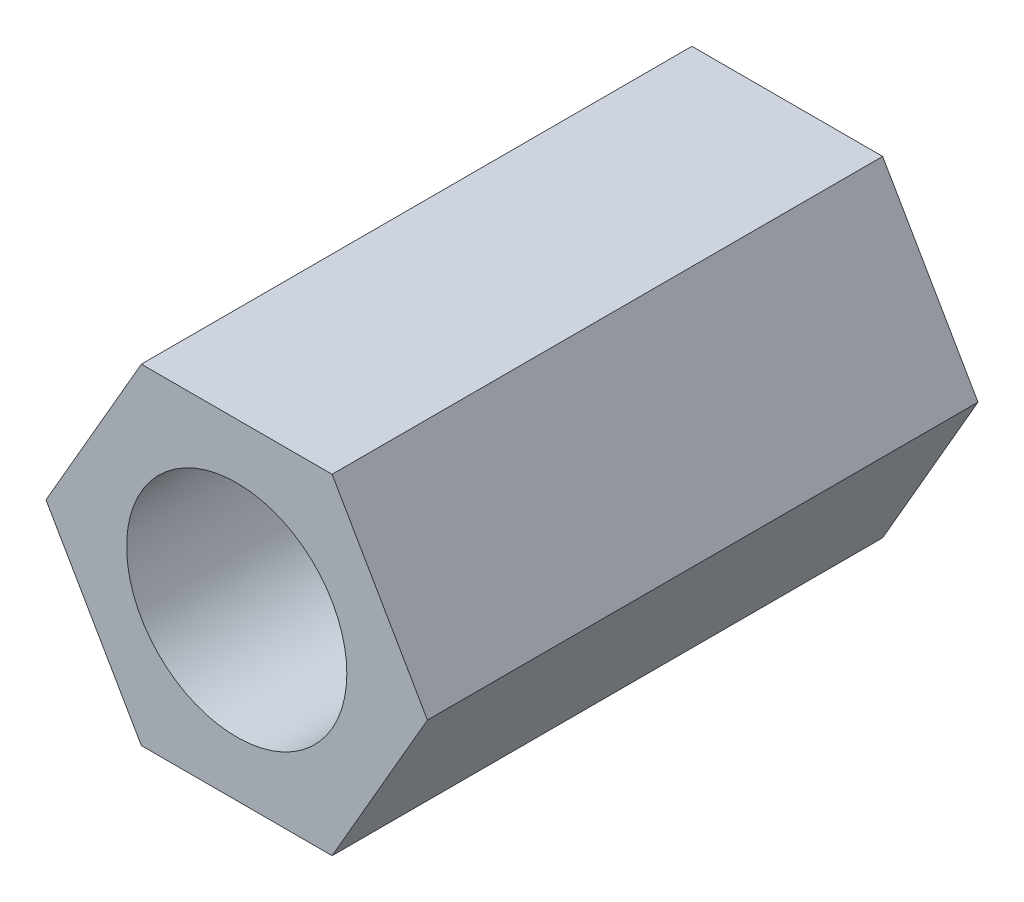
ISO-10303-21;
HEADER;
FILE_DESCRIPTION(('STEP AP214'),'2;1');
FILE_NAME('part.step','',(''),(''),'','','');
FILE_SCHEMA(('AUTOMOTIVE_DESIGN { 1 0 10303 214 1 1 1 1 }'));
ENDSEC;
DATA;
#1=APPLICATION_CONTEXT('core data for automotive mechanical design processes');
#2=APPLICATION_PROTOCOL_DEFINITION('international standard','automotive_design',2000,#1);
#3=PRODUCT_CONTEXT('',#1,'mechanical');
#4=PRODUCT('Part','Part','',(#3));
#5=PRODUCT_RELATED_PRODUCT_CATEGORY('part','',(#4));
#6=PRODUCT_DEFINITION_FORMATION('','',#4);
#7=PRODUCT_DEFINITION_CONTEXT('part definition',#1,'design');
#8=PRODUCT_DEFINITION('design','',#6,#7);
#9=PRODUCT_DEFINITION_SHAPE('','',#8);
#10=(LENGTH_UNIT() NAMED_UNIT(*) SI_UNIT(.MILLI.,.METRE.));
#11=(NAMED_UNIT(*) PLANE_ANGLE_UNIT() SI_UNIT($,.RADIAN.));
#12=(NAMED_UNIT(*) SI_UNIT($,.STERADIAN.) SOLID_ANGLE_UNIT());
#13=UNCERTAINTY_MEASURE_WITH_UNIT(LENGTH_MEASURE(1.E-05),#10,'distance_accuracy_value','');
#14=(GEOMETRIC_REPRESENTATION_CONTEXT(3) GLOBAL_UNCERTAINTY_ASSIGNED_CONTEXT((#13)) GLOBAL_UNIT_ASSIGNED_CONTEXT((#10,
#11,#12)) REPRESENTATION_CONTEXT('',''));
#15=CARTESIAN_POINT('',(0.,0.,0.));
#16=DIRECTION('',(0.,0.,1.));
#17=DIRECTION('',(1.,0.,0.));
#18=AXIS2_PLACEMENT_3D('',#15,#16,#17);
#19=CARTESIAN_POINT('',(0.,0.,5.));
#20=DIRECTION('',(0.,0.,1.));
#21=DIRECTION('',(1.,0.,0.));
#22=AXIS2_PLACEMENT_3D('',#19,#20,#21);
#23=PLANE('',#22);
#24=DIRECTION('',(0.5,0.866025403784438,0.));
#25=VECTOR('',#24,1.);
#26=CARTESIAN_POINT('',(0.86602540378444,-1.5,5.));
#27=LINE('',#26,#25);
#28=CARTESIAN_POINT('',(0.86602540378444,-1.5,5.));
#29=VERTEX_POINT('',#28);
#30=CARTESIAN_POINT('',(1.73205080756888,0.,5.));
#31=VERTEX_POINT('',#30);
#32=EDGE_CURVE('E146',#29,#31,#27,.T.);
#33=ORIENTED_EDGE('',*,*,#32,.T.);
#34=DIRECTION('',(-0.5,0.866025403784438,0.));
#35=VECTOR('',#34,1.);
#36=CARTESIAN_POINT('',(1.73205080756888,0.,5.));
#37=LINE('',#36,#35);
#38=CARTESIAN_POINT('',(0.866025403784438,1.5,5.));
#39=VERTEX_POINT('',#38);
#40=EDGE_CURVE('E94',#31,#39,#37,.T.);
#41=ORIENTED_EDGE('',*,*,#40,.T.);
#42=DIRECTION('',(-1.,0.,0.));
#43=VECTOR('',#42,1.);
#44=CARTESIAN_POINT('',(0.866025403784438,1.5,5.));
#45=LINE('',#44,#43);
#46=CARTESIAN_POINT('',(-0.866025403784439,1.5,5.));
#47=VERTEX_POINT('',#46);
#48=EDGE_CURVE('E107',#39,#47,#45,.T.);
#49=ORIENTED_EDGE('',*,*,#48,.T.);
#50=DIRECTION('',(-0.5,-0.866025403784438,0.));
#51=VECTOR('',#50,1.);
#52=CARTESIAN_POINT('',(-0.866025403784439,1.5,5.));
#53=LINE('',#52,#51);
#54=CARTESIAN_POINT('',(-1.73205080756888,0.,5.));
#55=VERTEX_POINT('',#54);
#56=EDGE_CURVE('E101',#47,#55,#53,.T.);
#57=ORIENTED_EDGE('',*,*,#56,.T.);
#58=DIRECTION('',(0.5,-0.866025403784438,0.));
#59=VECTOR('',#58,1.);
#60=CARTESIAN_POINT('',(-1.73205080756888,0.,5.));
#61=LINE('',#60,#59);
#62=CARTESIAN_POINT('',(-0.866025403784439,-1.5,5.));
#63=VERTEX_POINT('',#62);
#64=EDGE_CURVE('E105',#55,#63,#61,.T.);
#65=ORIENTED_EDGE('',*,*,#64,.T.);
#66=DIRECTION('',(1.,0.,0.));
#67=VECTOR('',#66,1.);
#68=CARTESIAN_POINT('',(-0.866025403784439,-1.5,5.));
#69=LINE('',#68,#67);
#70=EDGE_CURVE('E57',#63,#29,#69,.T.);
#71=ORIENTED_EDGE('',*,*,#70,.T.);
#72=EDGE_LOOP('',(#33,#41,#49,#57,#65,#71));
#73=FACE_BOUND('',#72,.T.);
#74=CARTESIAN_POINT('',(0.,0.,5.));
#75=DIRECTION('',(0.,0.,1.));
#76=DIRECTION('',(1.,0.,0.));
#77=AXIS2_PLACEMENT_3D('',#74,#75,#76);
#78=CIRCLE('',#77,1.);
#79=CARTESIAN_POINT('',(1.,0.,5.));
#80=VERTEX_POINT('',#79);
#81=EDGE_CURVE('E134',#80,#80,#78,.T.);
#82=ORIENTED_EDGE('',*,*,#81,.F.);
#83=EDGE_LOOP('',(#82));
#84=FACE_BOUND('',#83,.T.);
#85=ADVANCED_FACE('F39',(#73,#84),#23,.T.);
#86=CARTESIAN_POINT('',(0.,0.,0.));
#87=DIRECTION('',(0.,0.,1.));
#88=DIRECTION('',(1.,0.,0.));
#89=AXIS2_PLACEMENT_3D('',#86,#87,#88);
#90=PLANE('',#89);
#91=DIRECTION('',(0.5,0.866025403784438,0.));
#92=VECTOR('',#91,1.);
#93=CARTESIAN_POINT('',(0.86602540378444,-1.5,0.));
#94=LINE('',#93,#92);
#95=CARTESIAN_POINT('',(0.86602540378444,-1.5,0.));
#96=VERTEX_POINT('',#95);
#97=CARTESIAN_POINT('',(1.73205080756888,0.,0.));
#98=VERTEX_POINT('',#97);
#99=EDGE_CURVE('E129',#96,#98,#94,.T.);
#100=ORIENTED_EDGE('',*,*,#99,.F.);
#101=DIRECTION('',(1.,0.,0.));
#102=VECTOR('',#101,1.);
#103=CARTESIAN_POINT('',(-0.866025403784439,-1.5,0.));
#104=LINE('',#103,#102);
#105=CARTESIAN_POINT('',(-0.866025403784439,-1.5,0.));
#106=VERTEX_POINT('',#105);
#107=EDGE_CURVE('E86',#106,#96,#104,.T.);
#108=ORIENTED_EDGE('',*,*,#107,.F.);
#109=DIRECTION('',(0.5,-0.866025403784438,0.));
#110=VECTOR('',#109,1.);
#111=CARTESIAN_POINT('',(-1.73205080756888,0.,0.));
#112=LINE('',#111,#110);
#113=CARTESIAN_POINT('',(-1.73205080756888,0.,0.));
#114=VERTEX_POINT('',#113);
#115=EDGE_CURVE('E80',#114,#106,#112,.T.);
#116=ORIENTED_EDGE('',*,*,#115,.F.);
#117=DIRECTION('',(-0.5,-0.866025403784438,0.));
#118=VECTOR('',#117,1.);
#119=CARTESIAN_POINT('',(-0.866025403784439,1.5,0.));
#120=LINE('',#119,#118);
#121=CARTESIAN_POINT('',(-0.866025403784439,1.5,0.));
#122=VERTEX_POINT('',#121);
#123=EDGE_CURVE('E116',#122,#114,#120,.T.);
#124=ORIENTED_EDGE('',*,*,#123,.F.);
#125=DIRECTION('',(-1.,0.,0.));
#126=VECTOR('',#125,1.);
#127=CARTESIAN_POINT('',(0.866025403784438,1.5,0.));
#128=LINE('',#127,#126);
#129=CARTESIAN_POINT('',(0.866025403784438,1.5,0.));
#130=VERTEX_POINT('',#129);
#131=EDGE_CURVE('E137',#130,#122,#128,.T.);
#132=ORIENTED_EDGE('',*,*,#131,.F.);
#133=DIRECTION('',(-0.5,0.866025403784438,0.));
#134=VECTOR('',#133,1.);
#135=CARTESIAN_POINT('',(1.73205080756888,0.,0.));
#136=LINE('',#135,#134);
#137=EDGE_CURVE('E133',#98,#130,#136,.T.);
#138=ORIENTED_EDGE('',*,*,#137,.F.);
#139=EDGE_LOOP('',(#100,#108,#116,#124,#132,#138));
#140=FACE_BOUND('',#139,.T.);
#141=CARTESIAN_POINT('',(0.,0.,0.));
#142=DIRECTION('',(0.,0.,1.));
#143=DIRECTION('',(1.,0.,0.));
#144=AXIS2_PLACEMENT_3D('',#141,#142,#143);
#145=CIRCLE('',#144,1.);
#146=CARTESIAN_POINT('',(1.,0.,0.));
#147=VERTEX_POINT('',#146);
#148=EDGE_CURVE('E243',#147,#147,#145,.T.);
#149=ORIENTED_EDGE('',*,*,#148,.T.);
#150=EDGE_LOOP('',(#149));
#151=FACE_BOUND('',#150,.T.);
#152=ADVANCED_FACE('F159',(#140,#151),#90,.F.);
#153=CARTESIAN_POINT('',(0.86602540378444,-1.5,5.));
#154=DIRECTION('',(-0.866025403784439,0.5,0.));
#155=DIRECTION('',(-0.5,-0.866025403784439,0.));
#156=AXIS2_PLACEMENT_3D('',#153,#154,#155);
#157=PLANE('',#156);
#158=ORIENTED_EDGE('',*,*,#99,.T.);
#159=DIRECTION('',(0.,0.,-1.));
#160=VECTOR('',#159,1.);
#161=CARTESIAN_POINT('',(1.73205080756888,0.,5.));
#162=LINE('',#161,#160);
#163=EDGE_CURVE('E11',#31,#98,#162,.T.);
#164=ORIENTED_EDGE('',*,*,#163,.F.);
#165=ORIENTED_EDGE('',*,*,#32,.F.);
#166=DIRECTION('',(0.,0.,-1.));
#167=VECTOR('',#166,1.);
#168=CARTESIAN_POINT('',(0.86602540378444,-1.5,5.));
#169=LINE('',#168,#167);
#170=EDGE_CURVE('E125',#29,#96,#169,.T.);
#171=ORIENTED_EDGE('',*,*,#170,.T.);
#172=EDGE_LOOP('',(#158,#164,#165,#171));
#173=FACE_BOUND('',#172,.T.);
#174=ADVANCED_FACE('F41',(#173),#157,.F.);
#175=CARTESIAN_POINT('',(1.73205080756888,0.,5.));
#176=DIRECTION('',(-0.866025403784438,-0.5,0.));
#177=DIRECTION('',(0.5,-0.866025403784438,0.));
#178=AXIS2_PLACEMENT_3D('',#175,#176,#177);
#179=PLANE('',#178);
#180=ORIENTED_EDGE('',*,*,#137,.T.);
#181=DIRECTION('',(0.,0.,-1.));
#182=VECTOR('',#181,1.);
#183=CARTESIAN_POINT('',(0.866025403784438,1.5,5.));
#184=LINE('',#183,#182);
#185=EDGE_CURVE('E49',#39,#130,#184,.T.);
#186=ORIENTED_EDGE('',*,*,#185,.F.);
#187=ORIENTED_EDGE('',*,*,#40,.F.);
#188=ORIENTED_EDGE('',*,*,#163,.T.);
#189=EDGE_LOOP('',(#180,#186,#187,#188));
#190=FACE_BOUND('',#189,.T.);
#191=ADVANCED_FACE('F184',(#190),#179,.F.);
#192=CARTESIAN_POINT('',(0.866025403784438,1.5,5.));
#193=DIRECTION('',(0.,-1.,0.));
#194=DIRECTION('',(1.,0.,0.));
#195=AXIS2_PLACEMENT_3D('',#192,#193,#194);
#196=PLANE('',#195);
#197=ORIENTED_EDGE('',*,*,#131,.T.);
#198=DIRECTION('',(0.,0.,-1.));
#199=VECTOR('',#198,1.);
#200=CARTESIAN_POINT('',(-0.866025403784439,1.5,5.));
#201=LINE('',#200,#199);
#202=EDGE_CURVE('E118',#47,#122,#201,.T.);
#203=ORIENTED_EDGE('',*,*,#202,.F.);
#204=ORIENTED_EDGE('',*,*,#48,.F.);
#205=ORIENTED_EDGE('',*,*,#185,.T.);
#206=EDGE_LOOP('',(#197,#203,#204,#205));
#207=FACE_BOUND('',#206,.T.);
#208=ADVANCED_FACE('F156',(#207),#196,.F.);
#209=CARTESIAN_POINT('',(-0.866025403784439,1.5,5.));
#210=DIRECTION('',(0.866025403784439,-0.5,0.));
#211=DIRECTION('',(0.5,0.866025403784439,0.));
#212=AXIS2_PLACEMENT_3D('',#209,#210,#211);
#213=PLANE('',#212);
#214=ORIENTED_EDGE('',*,*,#123,.T.);
#215=DIRECTION('',(0.,0.,-1.));
#216=VECTOR('',#215,1.);
#217=CARTESIAN_POINT('',(-1.73205080756888,0.,5.));
#218=LINE('',#217,#216);
#219=EDGE_CURVE('E113',#55,#114,#218,.T.);
#220=ORIENTED_EDGE('',*,*,#219,.F.);
#221=ORIENTED_EDGE('',*,*,#56,.F.);
#222=ORIENTED_EDGE('',*,*,#202,.T.);
#223=EDGE_LOOP('',(#214,#220,#221,#222));
#224=FACE_BOUND('',#223,.T.);
#225=ADVANCED_FACE('F114',(#224),#213,.F.);
#226=CARTESIAN_POINT('',(-1.73205080756888,0.,5.));
#227=DIRECTION('',(0.866025403784438,0.5,0.));
#228=DIRECTION('',(-0.5,0.866025403784438,0.));
#229=AXIS2_PLACEMENT_3D('',#226,#227,#228);
#230=PLANE('',#229);
#231=ORIENTED_EDGE('',*,*,#115,.T.);
#232=DIRECTION('',(0.,0.,-1.));
#233=VECTOR('',#232,1.);
#234=CARTESIAN_POINT('',(-0.866025403784439,-1.5,5.));
#235=LINE('',#234,#233);
#236=EDGE_CURVE('E119',#63,#106,#235,.T.);
#237=ORIENTED_EDGE('',*,*,#236,.F.);
#238=ORIENTED_EDGE('',*,*,#64,.F.);
#239=ORIENTED_EDGE('',*,*,#219,.T.);
#240=EDGE_LOOP('',(#231,#237,#238,#239));
#241=FACE_BOUND('',#240,.T.);
#242=ADVANCED_FACE('F121',(#241),#230,.F.);
#243=CARTESIAN_POINT('',(-0.866025403784439,-1.5,5.));
#244=DIRECTION('',(0.,1.,0.));
#245=DIRECTION('',(-1.,0.,0.));
#246=AXIS2_PLACEMENT_3D('',#243,#244,#245);
#247=PLANE('',#246);
#248=ORIENTED_EDGE('',*,*,#107,.T.);
#249=ORIENTED_EDGE('',*,*,#170,.F.);
#250=ORIENTED_EDGE('',*,*,#70,.F.);
#251=ORIENTED_EDGE('',*,*,#236,.T.);
#252=EDGE_LOOP('',(#248,#249,#250,#251));
#253=FACE_BOUND('',#252,.T.);
#254=ADVANCED_FACE('F164',(#253),#247,.F.);
#255=CARTESIAN_POINT('',(0.,0.,5.));
#256=DIRECTION('',(0.,0.,-1.));
#257=DIRECTION('',(-1.,0.,0.));
#258=AXIS2_PLACEMENT_3D('',#255,#256,#257);
#259=CYLINDRICAL_SURFACE('',#258,1.);
#260=ORIENTED_EDGE('',*,*,#81,.T.);
#261=EDGE_LOOP('',(#260));
#262=FACE_BOUND('',#261,.T.);
#263=ORIENTED_EDGE('',*,*,#148,.F.);
#264=EDGE_LOOP('',(#263));
#265=FACE_BOUND('',#264,.T.);
#266=ADVANCED_FACE('F166',(#262,#265),#259,.F.);
#267=CLOSED_SHELL('',(#85,#152,#174,#191,#208,#225,#242,#254,#266));
#268=MANIFOLD_SOLID_BREP('B2',#267);
#269=ADVANCED_BREP_SHAPE_REPRESENTATION('',(#18,#268),#14);
#270=SHAPE_DEFINITION_REPRESENTATION(#9,#269);
ENDSEC;
END-ISO-10303-21;
